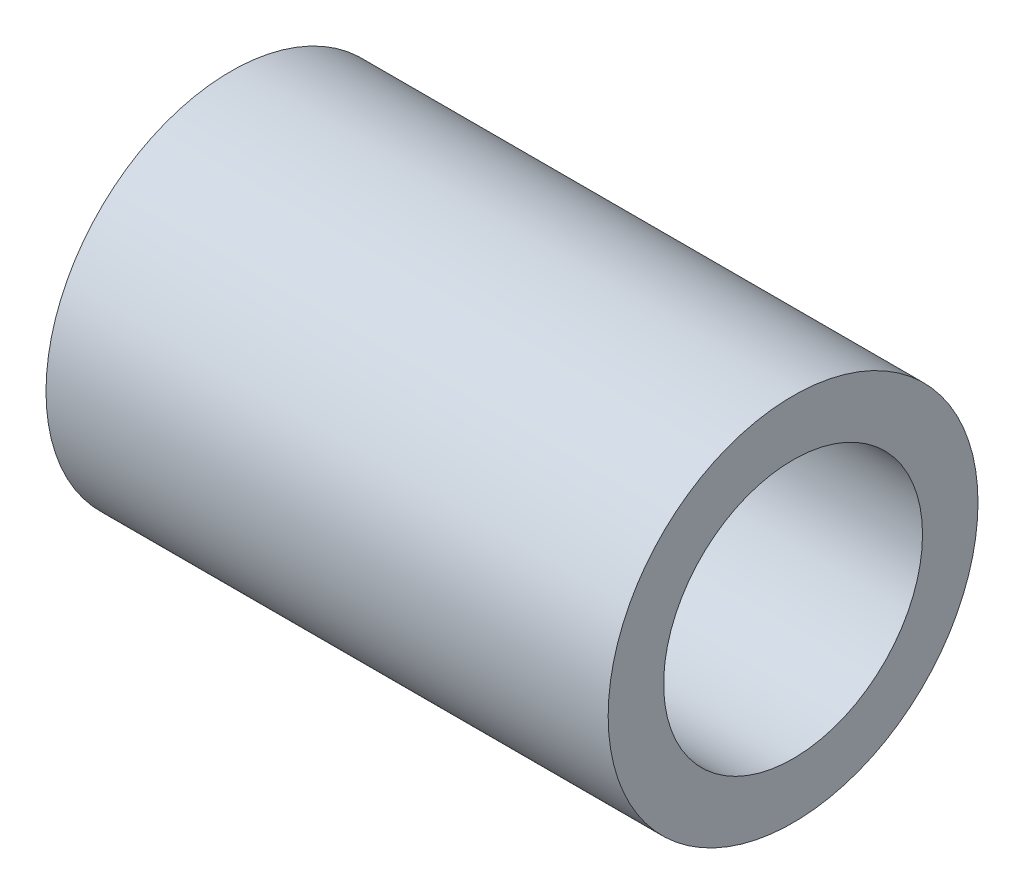
ISO-10303-21;
HEADER;
FILE_DESCRIPTION(('STEP AP214'),'2;1');
FILE_NAME('part.step','',(''),(''),'','','');
FILE_SCHEMA(('AUTOMOTIVE_DESIGN { 1 0 10303 214 1 1 1 1 }'));
ENDSEC;
DATA;
#1=APPLICATION_CONTEXT('core data for automotive mechanical design processes');
#2=APPLICATION_PROTOCOL_DEFINITION('international standard','automotive_design',2000,#1);
#3=PRODUCT_CONTEXT('',#1,'mechanical');
#4=PRODUCT('Part','Part','',(#3));
#5=PRODUCT_RELATED_PRODUCT_CATEGORY('part','',(#4));
#6=PRODUCT_DEFINITION_FORMATION('','',#4);
#7=PRODUCT_DEFINITION_CONTEXT('part definition',#1,'design');
#8=PRODUCT_DEFINITION('design','',#6,#7);
#9=PRODUCT_DEFINITION_SHAPE('','',#8);
#10=(LENGTH_UNIT() NAMED_UNIT(*) SI_UNIT(.MILLI.,.METRE.));
#11=(NAMED_UNIT(*) PLANE_ANGLE_UNIT() SI_UNIT($,.RADIAN.));
#12=(NAMED_UNIT(*) SI_UNIT($,.STERADIAN.) SOLID_ANGLE_UNIT());
#13=UNCERTAINTY_MEASURE_WITH_UNIT(LENGTH_MEASURE(1.E-05),#10,'distance_accuracy_value','');
#14=(GEOMETRIC_REPRESENTATION_CONTEXT(3) GLOBAL_UNCERTAINTY_ASSIGNED_CONTEXT((#13)) GLOBAL_UNIT_ASSIGNED_CONTEXT((#10,
#11,#12)) REPRESENTATION_CONTEXT('',''));
#15=CARTESIAN_POINT('',(0.,0.,0.));
#16=DIRECTION('',(0.,0.,1.));
#17=DIRECTION('',(1.,0.,0.));
#18=AXIS2_PLACEMENT_3D('',#15,#16,#17);
#19=CARTESIAN_POINT('',(-11.0710678118655,10.,-9.49999999999999));
#20=DIRECTION('',(1.,0.,0.));
#21=DIRECTION('',(0.,0.,-1.));
#22=AXIS2_PLACEMENT_3D('',#19,#20,#21);
#23=CYLINDRICAL_SURFACE('',#22,2.5);
#24=CARTESIAN_POINT('',(4.,10.,-9.49999999999999));
#25=DIRECTION('',(-1.,0.,0.));
#26=DIRECTION('',(0.,0.,1.));
#27=AXIS2_PLACEMENT_3D('',#24,#25,#26);
#28=CIRCLE('',#27,2.5);
#29=CARTESIAN_POINT('',(4.,10.,-12.));
#30=VERTEX_POINT('',#29);
#31=EDGE_CURVE('E43',#30,#30,#28,.T.);
#32=CARTESIAN_POINT('',(-3.6,10.,-9.49999999999999));
#33=DIRECTION('',(-1.,0.,0.));
#34=DIRECTION('',(0.,0.,1.));
#35=AXIS2_PLACEMENT_3D('',#32,#33,#34);
#36=CIRCLE('',#35,2.5);
#37=CARTESIAN_POINT('',(-3.6,10.,-12.));
#38=VERTEX_POINT('',#37);
#39=EDGE_CURVE('E10',#38,#38,#36,.T.);
#40=CARTESIAN_POINT('',(4.,10.,-12.));
#41=CARTESIAN_POINT('',(3.92083333333333,10.,-12.));
#42=CARTESIAN_POINT('',(3.84166666666667,10.,-12.));
#43=CARTESIAN_POINT('',(3.68333333333333,10.,-12.));
#44=CARTESIAN_POINT('',(3.60416666666667,10.,-12.));
#45=CARTESIAN_POINT('',(3.44583333333333,10.,-12.));
#46=CARTESIAN_POINT('',(3.36666666666667,10.,-12.));
#47=CARTESIAN_POINT('',(3.20833333333333,10.,-12.));
#48=CARTESIAN_POINT('',(3.12916666666667,10.,-12.));
#49=CARTESIAN_POINT('',(2.97083333333333,10.,-12.));
#50=CARTESIAN_POINT('',(2.89166666666667,10.,-12.));
#51=CARTESIAN_POINT('',(2.73333333333333,10.,-12.));
#52=CARTESIAN_POINT('',(2.65416666666667,10.,-12.));
#53=CARTESIAN_POINT('',(2.49583333333333,10.,-12.));
#54=CARTESIAN_POINT('',(2.41666666666666,10.,-12.));
#55=CARTESIAN_POINT('',(2.25833333333333,10.,-12.));
#56=CARTESIAN_POINT('',(2.17916666666667,10.,-12.));
#57=CARTESIAN_POINT('',(2.02083333333333,10.,-12.));
#58=CARTESIAN_POINT('',(1.94166666666667,10.,-12.));
#59=CARTESIAN_POINT('',(1.78333333333333,10.,-12.));
#60=CARTESIAN_POINT('',(1.70416666666667,10.,-12.));
#61=CARTESIAN_POINT('',(1.54583333333333,10.,-12.));
#62=CARTESIAN_POINT('',(1.46666666666667,10.,-12.));
#63=CARTESIAN_POINT('',(1.30833333333333,10.,-12.));
#64=CARTESIAN_POINT('',(1.22916666666666,10.,-12.));
#65=CARTESIAN_POINT('',(1.07083333333333,10.,-12.));
#66=CARTESIAN_POINT('',(0.991666666666665,10.,-12.));
#67=CARTESIAN_POINT('',(0.833333333333332,10.,-12.));
#68=CARTESIAN_POINT('',(0.754166666666665,10.,-12.));
#69=CARTESIAN_POINT('',(0.595833333333332,10.,-12.));
#70=CARTESIAN_POINT('',(0.516666666666665,10.,-12.));
#71=CARTESIAN_POINT('',(0.358333333333332,10.,-12.));
#72=CARTESIAN_POINT('',(0.279166666666665,10.,-12.));
#73=CARTESIAN_POINT('',(0.120833333333332,10.,-12.));
#74=CARTESIAN_POINT('',(0.0416666666666655,10.,-12.));
#75=CARTESIAN_POINT('',(-0.116666666666668,10.,-12.));
#76=CARTESIAN_POINT('',(-0.195833333333334,10.,-12.));
#77=CARTESIAN_POINT('',(-0.354166666666668,10.,-12.));
#78=CARTESIAN_POINT('',(-0.433333333333334,10.,-12.));
#79=CARTESIAN_POINT('',(-0.591666666666667,10.,-12.));
#80=CARTESIAN_POINT('',(-0.670833333333334,10.,-12.));
#81=CARTESIAN_POINT('',(-0.829166666666667,10.,-12.));
#82=CARTESIAN_POINT('',(-0.908333333333334,10.,-12.));
#83=CARTESIAN_POINT('',(-1.06666666666667,10.,-12.));
#84=CARTESIAN_POINT('',(-1.14583333333333,10.,-12.));
#85=CARTESIAN_POINT('',(-1.30416666666667,10.,-12.));
#86=CARTESIAN_POINT('',(-1.38333333333333,10.,-12.));
#87=CARTESIAN_POINT('',(-1.54166666666667,10.,-12.));
#88=CARTESIAN_POINT('',(-1.62083333333333,10.,-12.));
#89=CARTESIAN_POINT('',(-1.77916666666667,10.,-12.));
#90=CARTESIAN_POINT('',(-1.85833333333333,10.,-12.));
#91=CARTESIAN_POINT('',(-2.01666666666667,10.,-12.));
#92=CARTESIAN_POINT('',(-2.09583333333333,10.,-12.));
#93=CARTESIAN_POINT('',(-2.25416666666667,10.,-12.));
#94=CARTESIAN_POINT('',(-2.33333333333333,10.,-12.));
#95=CARTESIAN_POINT('',(-2.49166666666667,10.,-12.));
#96=CARTESIAN_POINT('',(-2.57083333333333,10.,-12.));
#97=CARTESIAN_POINT('',(-2.72916666666667,10.,-12.));
#98=CARTESIAN_POINT('',(-2.80833333333333,10.,-12.));
#99=CARTESIAN_POINT('',(-2.96666666666667,10.,-12.));
#100=CARTESIAN_POINT('',(-3.04583333333333,10.,-12.));
#101=CARTESIAN_POINT('',(-3.20416666666667,10.,-12.));
#102=CARTESIAN_POINT('',(-3.28333333333333,10.,-12.));
#103=CARTESIAN_POINT('',(-3.44166666666667,10.,-12.));
#104=CARTESIAN_POINT('',(-3.52083333333333,10.,-12.));
#105=CARTESIAN_POINT('',(-3.6,10.,-12.));
#106=B_SPLINE_CURVE_WITH_KNOTS('',3,(#40,#41,#42,#43,#44,#45,#46,#47,#48,#49,#50,#51,#52,#53,
#54,#55,#56,#57,#58,#59,#60,#61,#62,#63,#64,#65,#66,#67,#68,#69,#70,#71,#72,#73,#74,#75,#76,#77,
#78,#79,#80,#81,#82,#83,#84,#85,#86,#87,#88,#89,#90,#91,#92,#93,#94,#95,#96,#97,#98,#99,#100,
#101,#102,#103,#104,#105),.UNSPECIFIED.,.F.,.F.,(4,2,2,2,2,2,2,2,2,2,2,2,2,2,2,2,2,2,2,2,2,2,2,
2,2,2,2,2,2,2,2,2,4),(0.,0.2375,0.475,0.7125,0.95,1.1875,1.425,1.6625,1.9,2.1375,2.375,2.6125,
2.85,3.0875,3.325,3.5625,3.8,4.0375,4.275,4.5125,4.75,4.9875,5.225,5.4625,5.7,5.9375,6.175,
6.4125,6.65,6.8875,7.125,7.3625,7.6),.UNSPECIFIED.);
#107=EDGE_CURVE('BSEAM35',#30,#38,#106,.T.);
#108=ORIENTED_EDGE('',*,*,#31,.T.);
#109=ORIENTED_EDGE('',*,*,#39,.F.);
#110=ORIENTED_EDGE('',*,*,#107,.T.);
#111=ORIENTED_EDGE('',*,*,#107,.F.);
#112=EDGE_LOOP('',(#108,#110,#109,#111));
#113=FACE_BOUND('',#112,.T.);
#114=ADVANCED_FACE('F35',(#113),#23,.T.);
#115=CARTESIAN_POINT('',(4.,10.,-9.49999999999999));
#116=DIRECTION('',(-1.,0.,0.));
#117=DIRECTION('',(0.,0.,1.));
#118=AXIS2_PLACEMENT_3D('',#115,#116,#117);
#119=PLANE('',#118);
#120=ORIENTED_EDGE('',*,*,#31,.F.);
#121=EDGE_LOOP('',(#120));
#122=FACE_BOUND('',#121,.T.);
#123=CARTESIAN_POINT('',(4.,10.,-9.49999999999999));
#124=DIRECTION('',(-1.,0.,0.));
#125=DIRECTION('',(0.,0.,1.));
#126=AXIS2_PLACEMENT_3D('',#123,#124,#125);
#127=CIRCLE('',#126,1.75);
#128=CARTESIAN_POINT('',(4.,10.,-11.25));
#129=VERTEX_POINT('',#128);
#130=EDGE_CURVE('E50',#129,#129,#127,.T.);
#131=ORIENTED_EDGE('',*,*,#130,.T.);
#132=EDGE_LOOP('',(#131));
#133=FACE_BOUND('',#132,.T.);
#134=ADVANCED_FACE('F67',(#122,#133),#119,.F.);
#135=CARTESIAN_POINT('',(-11.0710678118655,10.,-9.49999999999999));
#136=DIRECTION('',(1.,0.,0.));
#137=DIRECTION('',(0.,0.,-1.));
#138=AXIS2_PLACEMENT_3D('',#135,#136,#137);
#139=CYLINDRICAL_SURFACE('',#138,1.75);
#140=CARTESIAN_POINT('',(-3.6,10.,-9.49999999999999));
#141=DIRECTION('',(-1.,0.,0.));
#142=DIRECTION('',(0.,0.,1.));
#143=AXIS2_PLACEMENT_3D('',#140,#141,#142);
#144=CIRCLE('',#143,1.75);
#145=CARTESIAN_POINT('',(-3.6,10.,-11.25));
#146=VERTEX_POINT('',#145);
#147=EDGE_CURVE('E38',#146,#146,#144,.T.);
#148=CARTESIAN_POINT('',(4.,10.,-11.25));
#149=CARTESIAN_POINT('',(3.92083333333333,10.,-11.25));
#150=CARTESIAN_POINT('',(3.84166666666667,10.,-11.25));
#151=CARTESIAN_POINT('',(3.68333333333333,10.,-11.25));
#152=CARTESIAN_POINT('',(3.60416666666667,10.,-11.25));
#153=CARTESIAN_POINT('',(3.44583333333333,10.,-11.25));
#154=CARTESIAN_POINT('',(3.36666666666667,10.,-11.25));
#155=CARTESIAN_POINT('',(3.20833333333333,10.,-11.25));
#156=CARTESIAN_POINT('',(3.12916666666667,10.,-11.25));
#157=CARTESIAN_POINT('',(2.97083333333333,10.,-11.25));
#158=CARTESIAN_POINT('',(2.89166666666667,10.,-11.25));
#159=CARTESIAN_POINT('',(2.73333333333333,10.,-11.25));
#160=CARTESIAN_POINT('',(2.65416666666667,10.,-11.25));
#161=CARTESIAN_POINT('',(2.49583333333333,10.,-11.25));
#162=CARTESIAN_POINT('',(2.41666666666666,10.,-11.25));
#163=CARTESIAN_POINT('',(2.25833333333333,10.,-11.25));
#164=CARTESIAN_POINT('',(2.17916666666667,10.,-11.25));
#165=CARTESIAN_POINT('',(2.02083333333333,10.,-11.25));
#166=CARTESIAN_POINT('',(1.94166666666667,10.,-11.25));
#167=CARTESIAN_POINT('',(1.78333333333333,10.,-11.25));
#168=CARTESIAN_POINT('',(1.70416666666667,10.,-11.25));
#169=CARTESIAN_POINT('',(1.54583333333333,10.,-11.25));
#170=CARTESIAN_POINT('',(1.46666666666667,10.,-11.25));
#171=CARTESIAN_POINT('',(1.30833333333333,10.,-11.25));
#172=CARTESIAN_POINT('',(1.22916666666666,10.,-11.25));
#173=CARTESIAN_POINT('',(1.07083333333333,10.,-11.25));
#174=CARTESIAN_POINT('',(0.991666666666665,10.,-11.25));
#175=CARTESIAN_POINT('',(0.833333333333332,10.,-11.25));
#176=CARTESIAN_POINT('',(0.754166666666665,10.,-11.25));
#177=CARTESIAN_POINT('',(0.595833333333332,10.,-11.25));
#178=CARTESIAN_POINT('',(0.516666666666665,10.,-11.25));
#179=CARTESIAN_POINT('',(0.358333333333332,10.,-11.25));
#180=CARTESIAN_POINT('',(0.279166666666665,10.,-11.25));
#181=CARTESIAN_POINT('',(0.120833333333332,10.,-11.25));
#182=CARTESIAN_POINT('',(0.0416666666666655,10.,-11.25));
#183=CARTESIAN_POINT('',(-0.116666666666668,10.,-11.25));
#184=CARTESIAN_POINT('',(-0.195833333333334,10.,-11.25));
#185=CARTESIAN_POINT('',(-0.354166666666668,10.,-11.25));
#186=CARTESIAN_POINT('',(-0.433333333333334,10.,-11.25));
#187=CARTESIAN_POINT('',(-0.591666666666667,10.,-11.25));
#188=CARTESIAN_POINT('',(-0.670833333333334,10.,-11.25));
#189=CARTESIAN_POINT('',(-0.829166666666667,10.,-11.25));
#190=CARTESIAN_POINT('',(-0.908333333333334,10.,-11.25));
#191=CARTESIAN_POINT('',(-1.06666666666667,10.,-11.25));
#192=CARTESIAN_POINT('',(-1.14583333333333,10.,-11.25));
#193=CARTESIAN_POINT('',(-1.30416666666667,10.,-11.25));
#194=CARTESIAN_POINT('',(-1.38333333333333,10.,-11.25));
#195=CARTESIAN_POINT('',(-1.54166666666667,10.,-11.25));
#196=CARTESIAN_POINT('',(-1.62083333333333,10.,-11.25));
#197=CARTESIAN_POINT('',(-1.77916666666667,10.,-11.25));
#198=CARTESIAN_POINT('',(-1.85833333333333,10.,-11.25));
#199=CARTESIAN_POINT('',(-2.01666666666667,10.,-11.25));
#200=CARTESIAN_POINT('',(-2.09583333333333,10.,-11.25));
#201=CARTESIAN_POINT('',(-2.25416666666667,10.,-11.25));
#202=CARTESIAN_POINT('',(-2.33333333333333,10.,-11.25));
#203=CARTESIAN_POINT('',(-2.49166666666667,10.,-11.25));
#204=CARTESIAN_POINT('',(-2.57083333333333,10.,-11.25));
#205=CARTESIAN_POINT('',(-2.72916666666667,10.,-11.25));
#206=CARTESIAN_POINT('',(-2.80833333333333,10.,-11.25));
#207=CARTESIAN_POINT('',(-2.96666666666667,10.,-11.25));
#208=CARTESIAN_POINT('',(-3.04583333333333,10.,-11.25));
#209=CARTESIAN_POINT('',(-3.20416666666667,10.,-11.25));
#210=CARTESIAN_POINT('',(-3.28333333333333,10.,-11.25));
#211=CARTESIAN_POINT('',(-3.44166666666667,10.,-11.25));
#212=CARTESIAN_POINT('',(-3.52083333333333,10.,-11.25));
#213=CARTESIAN_POINT('',(-3.6,10.,-11.25));
#214=B_SPLINE_CURVE_WITH_KNOTS('',3,(#148,#149,#150,#151,#152,#153,#154,#155,#156,#157,#158,
#159,#160,#161,#162,#163,#164,#165,#166,#167,#168,#169,#170,#171,#172,#173,#174,#175,#176,#177,
#178,#179,#180,#181,#182,#183,#184,#185,#186,#187,#188,#189,#190,#191,#192,#193,#194,#195,#196,
#197,#198,#199,#200,#201,#202,#203,#204,#205,#206,#207,#208,#209,#210,#211,#212,#213),
.UNSPECIFIED.,.F.,.F.,(4,2,2,2,2,2,2,2,2,2,2,2,2,2,2,2,2,2,2,2,2,2,2,2,2,2,2,2,2,2,2,2,4),(0.,
0.2375,0.475,0.7125,0.95,1.1875,1.425,1.6625,1.9,2.1375,2.375,2.6125,2.85,3.0875,3.325,3.5625,
3.8,4.0375,4.275,4.5125,4.75,4.9875,5.225,5.4625,5.7,5.9375,6.175,6.4125,6.65,6.8875,7.125,
7.3625,7.6),.UNSPECIFIED.);
#215=EDGE_CURVE('BSEAM59',#129,#146,#214,.T.);
#216=ORIENTED_EDGE('',*,*,#130,.F.);
#217=ORIENTED_EDGE('',*,*,#147,.T.);
#218=ORIENTED_EDGE('',*,*,#215,.T.);
#219=ORIENTED_EDGE('',*,*,#215,.F.);
#220=EDGE_LOOP('',(#216,#218,#217,#219));
#221=FACE_BOUND('',#220,.T.);
#222=ADVANCED_FACE('F59',(#221),#139,.F.);
#223=CARTESIAN_POINT('',(-3.6,20.,0.));
#224=DIRECTION('',(-1.,0.,0.));
#225=DIRECTION('',(0.,0.,1.));
#226=AXIS2_PLACEMENT_3D('',#223,#224,#225);
#227=PLANE('',#226);
#228=ORIENTED_EDGE('',*,*,#147,.F.);
#229=EDGE_LOOP('',(#228));
#230=FACE_BOUND('',#229,.T.);
#231=ORIENTED_EDGE('',*,*,#39,.T.);
#232=EDGE_LOOP('',(#231));
#233=FACE_BOUND('',#232,.T.);
#234=ADVANCED_FACE('F61',(#230,#233),#227,.T.);
#235=CLOSED_SHELL('',(#114,#134,#222,#234));
#236=MANIFOLD_SOLID_BREP('B2',#235);
#237=ADVANCED_BREP_SHAPE_REPRESENTATION('',(#18,#236),#14);
#238=SHAPE_DEFINITION_REPRESENTATION(#9,#237);
ENDSEC;
END-ISO-10303-21;
